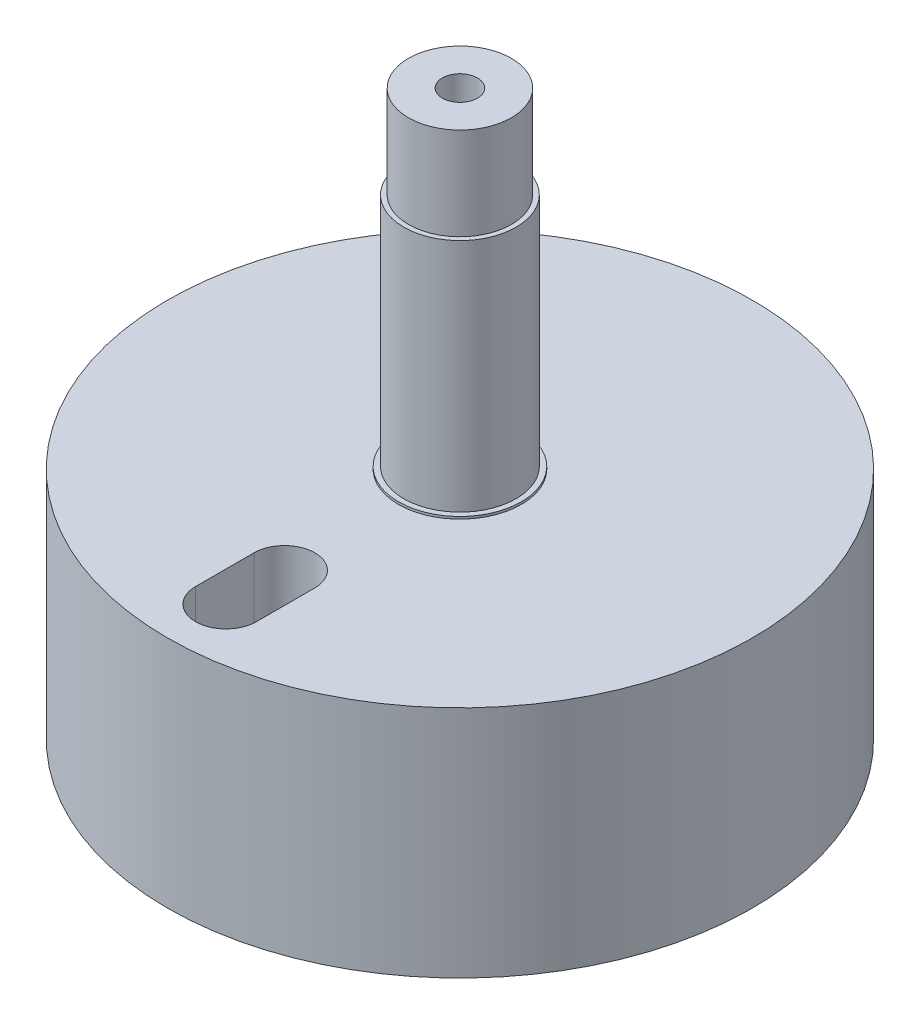
ISO-10303-21;
HEADER;
FILE_DESCRIPTION(('STEP AP214'),'2;1');
FILE_NAME('part.step','',(''),(''),'','','');
FILE_SCHEMA(('AUTOMOTIVE_DESIGN { 1 0 10303 214 1 1 1 1 }'));
ENDSEC;
DATA;
#1=APPLICATION_CONTEXT('core data for automotive mechanical design processes');
#2=APPLICATION_PROTOCOL_DEFINITION('international standard','automotive_design',2000,#1);
#3=PRODUCT_CONTEXT('',#1,'mechanical');
#4=PRODUCT('Part','Part','',(#3));
#5=PRODUCT_RELATED_PRODUCT_CATEGORY('part','',(#4));
#6=PRODUCT_DEFINITION_FORMATION('','',#4);
#7=PRODUCT_DEFINITION_CONTEXT('part definition',#1,'design');
#8=PRODUCT_DEFINITION('design','',#6,#7);
#9=PRODUCT_DEFINITION_SHAPE('','',#8);
#10=(LENGTH_UNIT() NAMED_UNIT(*) SI_UNIT(.MILLI.,.METRE.));
#11=(NAMED_UNIT(*) PLANE_ANGLE_UNIT() SI_UNIT($,.RADIAN.));
#12=(NAMED_UNIT(*) SI_UNIT($,.STERADIAN.) SOLID_ANGLE_UNIT());
#13=UNCERTAINTY_MEASURE_WITH_UNIT(LENGTH_MEASURE(1.E-05),#10,'distance_accuracy_value','');
#14=(GEOMETRIC_REPRESENTATION_CONTEXT(3) GLOBAL_UNCERTAINTY_ASSIGNED_CONTEXT((#13)) GLOBAL_UNIT_ASSIGNED_CONTEXT((#10,
#11,#12)) REPRESENTATION_CONTEXT('',''));
#15=CARTESIAN_POINT('',(0.,0.,0.));
#16=DIRECTION('',(0.,0.,1.));
#17=DIRECTION('',(1.,0.,0.));
#18=AXIS2_PLACEMENT_3D('',#15,#16,#17);
#19=CARTESIAN_POINT('',(0.,20.,0.));
#20=DIRECTION('',(0.,-1.,0.));
#21=DIRECTION('',(0.,0.,-1.));
#22=AXIS2_PLACEMENT_3D('',#19,#20,#21);
#23=CYLINDRICAL_SURFACE('',#22,25.);
#24=CARTESIAN_POINT('',(0.,20.,0.));
#25=DIRECTION('',(0.,1.,0.));
#26=DIRECTION('',(0.,0.,1.));
#27=AXIS2_PLACEMENT_3D('',#24,#25,#26);
#28=CIRCLE('',#27,25.);
#29=CARTESIAN_POINT('',(0.,20.,25.));
#30=VERTEX_POINT('',#29);
#31=EDGE_CURVE('E119',#30,#30,#28,.T.);
#32=ORIENTED_EDGE('',*,*,#31,.F.);
#33=EDGE_LOOP('',(#32));
#34=FACE_BOUND('',#33,.T.);
#35=CARTESIAN_POINT('',(0.,0.,0.));
#36=DIRECTION('',(0.,1.,0.));
#37=DIRECTION('',(0.,0.,1.));
#38=AXIS2_PLACEMENT_3D('',#35,#36,#37);
#39=CIRCLE('',#38,25.);
#40=CARTESIAN_POINT('',(0.,0.,25.));
#41=VERTEX_POINT('',#40);
#42=EDGE_CURVE('E42',#41,#41,#39,.T.);
#43=ORIENTED_EDGE('',*,*,#42,.T.);
#44=EDGE_LOOP('',(#43));
#45=FACE_BOUND('',#44,.T.);
#46=ADVANCED_FACE('F39',(#34,#45),#23,.T.);
#47=CARTESIAN_POINT('',(0.,20.,0.));
#48=DIRECTION('',(0.,1.,0.));
#49=DIRECTION('',(0.,0.,1.));
#50=AXIS2_PLACEMENT_3D('',#47,#48,#49);
#51=PLANE('',#50);
#52=CARTESIAN_POINT('',(0.,20.,0.));
#53=DIRECTION('',(0.,1.,0.));
#54=DIRECTION('',(0.,0.,1.));
#55=AXIS2_PLACEMENT_3D('',#52,#53,#54);
#56=CIRCLE('',#55,5.25);
#57=CARTESIAN_POINT('',(0.,20.,5.25));
#58=VERTEX_POINT('',#57);
#59=EDGE_CURVE('E279',#58,#58,#56,.T.);
#60=ORIENTED_EDGE('',*,*,#59,.F.);
#61=EDGE_LOOP('',(#60));
#62=FACE_BOUND('',#61,.T.);
#63=CARTESIAN_POINT('',(0.,20.,15.));
#64=DIRECTION('',(0.,1.,0.));
#65=DIRECTION('',(0.,0.,1.));
#66=AXIS2_PLACEMENT_3D('',#63,#64,#65);
#67=CIRCLE('',#66,2.6);
#68=CARTESIAN_POINT('',(2.6,20.,15.));
#69=VERTEX_POINT('',#68);
#70=CARTESIAN_POINT('',(-2.6,20.,15.));
#71=VERTEX_POINT('',#70);
#72=EDGE_CURVE('E55',#69,#71,#67,.T.);
#73=ORIENTED_EDGE('',*,*,#72,.F.);
#74=DIRECTION('',(0.,0.,-1.));
#75=VECTOR('',#74,1.);
#76=CARTESIAN_POINT('',(2.6,20.,15.));
#77=LINE('',#76,#75);
#78=CARTESIAN_POINT('',(2.6,20.,20.));
#79=VERTEX_POINT('',#78);
#80=EDGE_CURVE('E106',#79,#69,#77,.T.);
#81=ORIENTED_EDGE('',*,*,#80,.F.);
#82=CARTESIAN_POINT('',(0.,20.,20.));
#83=DIRECTION('',(0.,1.,0.));
#84=DIRECTION('',(0.,0.,1.));
#85=AXIS2_PLACEMENT_3D('',#82,#83,#84);
#86=CIRCLE('',#85,2.6);
#87=CARTESIAN_POINT('',(-2.6,20.,20.));
#88=VERTEX_POINT('',#87);
#89=EDGE_CURVE('E114',#88,#79,#86,.T.);
#90=ORIENTED_EDGE('',*,*,#89,.F.);
#91=DIRECTION('',(0.,0.,1.));
#92=VECTOR('',#91,1.);
#93=CARTESIAN_POINT('',(-2.6,20.,15.));
#94=LINE('',#93,#92);
#95=EDGE_CURVE('E90',#71,#88,#94,.T.);
#96=ORIENTED_EDGE('',*,*,#95,.F.);
#97=EDGE_LOOP('',(#73,#81,#90,#96));
#98=FACE_BOUND('',#97,.T.);
#99=ORIENTED_EDGE('',*,*,#31,.T.);
#100=EDGE_LOOP('',(#99));
#101=FACE_BOUND('',#100,.T.);
#102=ADVANCED_FACE('F132',(#62,#98,#101),#51,.T.);
#103=CARTESIAN_POINT('',(0.,0.,0.));
#104=DIRECTION('',(0.,1.,0.));
#105=DIRECTION('',(0.,0.,1.));
#106=AXIS2_PLACEMENT_3D('',#103,#104,#105);
#107=PLANE('',#106);
#108=CARTESIAN_POINT('',(0.,0.,0.));
#109=DIRECTION('',(0.,-1.,0.));
#110=DIRECTION('',(0.,0.,-1.));
#111=AXIS2_PLACEMENT_3D('',#108,#109,#110);
#112=CIRCLE('',#111,1.5);
#113=CARTESIAN_POINT('',(0.,0.,-1.5));
#114=VERTEX_POINT('',#113);
#115=EDGE_CURVE('E270',#114,#114,#112,.T.);
#116=ORIENTED_EDGE('',*,*,#115,.F.);
#117=EDGE_LOOP('',(#116));
#118=FACE_BOUND('',#117,.T.);
#119=CARTESIAN_POINT('',(0.,0.,17.5));
#120=DIRECTION('',(0.,1.,0.));
#121=DIRECTION('',(0.,0.,1.));
#122=AXIS2_PLACEMENT_3D('',#119,#120,#121);
#123=CIRCLE('',#122,1.5);
#124=CARTESIAN_POINT('',(0.,0.,19.));
#125=VERTEX_POINT('',#124);
#126=EDGE_CURVE('E112',#125,#125,#123,.T.);
#127=ORIENTED_EDGE('',*,*,#126,.T.);
#128=EDGE_LOOP('',(#127));
#129=FACE_BOUND('',#128,.T.);
#130=ORIENTED_EDGE('',*,*,#42,.F.);
#131=EDGE_LOOP('',(#130));
#132=FACE_BOUND('',#131,.T.);
#133=ADVANCED_FACE('F129',(#118,#129,#132),#107,.F.);
#134=CARTESIAN_POINT('',(0.,10.,15.));
#135=DIRECTION('',(0.,1.,0.));
#136=DIRECTION('',(0.,0.,1.));
#137=AXIS2_PLACEMENT_3D('',#134,#135,#136);
#138=CYLINDRICAL_SURFACE('',#137,2.6);
#139=ORIENTED_EDGE('',*,*,#72,.T.);
#140=DIRECTION('',(0.,1.,0.));
#141=VECTOR('',#140,1.);
#142=CARTESIAN_POINT('',(-2.6,10.,15.));
#143=LINE('',#142,#141);
#144=CARTESIAN_POINT('',(-2.6,10.,15.));
#145=VERTEX_POINT('',#144);
#146=EDGE_CURVE('E78',#145,#71,#143,.T.);
#147=ORIENTED_EDGE('',*,*,#146,.F.);
#148=CARTESIAN_POINT('',(0.,10.,15.));
#149=DIRECTION('',(0.,1.,0.));
#150=DIRECTION('',(0.,0.,1.));
#151=AXIS2_PLACEMENT_3D('',#148,#149,#150);
#152=CIRCLE('',#151,2.6);
#153=CARTESIAN_POINT('',(2.6,10.,15.));
#154=VERTEX_POINT('',#153);
#155=EDGE_CURVE('E104',#154,#145,#152,.T.);
#156=ORIENTED_EDGE('',*,*,#155,.F.);
#157=DIRECTION('',(0.,1.,0.));
#158=VECTOR('',#157,1.);
#159=CARTESIAN_POINT('',(2.6,10.,15.));
#160=LINE('',#159,#158);
#161=EDGE_CURVE('E63',#154,#69,#160,.T.);
#162=ORIENTED_EDGE('',*,*,#161,.T.);
#163=EDGE_LOOP('',(#139,#147,#156,#162));
#164=FACE_BOUND('',#163,.T.);
#165=ADVANCED_FACE('F131',(#164),#138,.F.);
#166=CARTESIAN_POINT('',(2.6,10.,15.));
#167=DIRECTION('',(1.,0.,0.));
#168=DIRECTION('',(0.,0.,-1.));
#169=AXIS2_PLACEMENT_3D('',#166,#167,#168);
#170=PLANE('',#169);
#171=ORIENTED_EDGE('',*,*,#80,.T.);
#172=ORIENTED_EDGE('',*,*,#161,.F.);
#173=DIRECTION('',(0.,0.,-1.));
#174=VECTOR('',#173,1.);
#175=CARTESIAN_POINT('',(2.6,10.,15.));
#176=LINE('',#175,#174);
#177=CARTESIAN_POINT('',(2.6,10.,20.));
#178=VERTEX_POINT('',#177);
#179=EDGE_CURVE('E101',#178,#154,#176,.T.);
#180=ORIENTED_EDGE('',*,*,#179,.F.);
#181=DIRECTION('',(0.,1.,0.));
#182=VECTOR('',#181,1.);
#183=CARTESIAN_POINT('',(2.6,10.,20.));
#184=LINE('',#183,#182);
#185=EDGE_CURVE('E94',#178,#79,#184,.T.);
#186=ORIENTED_EDGE('',*,*,#185,.T.);
#187=EDGE_LOOP('',(#171,#172,#180,#186));
#188=FACE_BOUND('',#187,.T.);
#189=ADVANCED_FACE('F139',(#188),#170,.F.);
#190=CARTESIAN_POINT('',(0.,10.,20.));
#191=DIRECTION('',(0.,1.,0.));
#192=DIRECTION('',(0.,0.,1.));
#193=AXIS2_PLACEMENT_3D('',#190,#191,#192);
#194=CYLINDRICAL_SURFACE('',#193,2.6);
#195=ORIENTED_EDGE('',*,*,#89,.T.);
#196=ORIENTED_EDGE('',*,*,#185,.F.);
#197=CARTESIAN_POINT('',(0.,10.,20.));
#198=DIRECTION('',(0.,1.,0.));
#199=DIRECTION('',(0.,0.,1.));
#200=AXIS2_PLACEMENT_3D('',#197,#198,#199);
#201=CIRCLE('',#200,2.6);
#202=CARTESIAN_POINT('',(-2.6,10.,20.));
#203=VERTEX_POINT('',#202);
#204=EDGE_CURVE('E97',#203,#178,#201,.T.);
#205=ORIENTED_EDGE('',*,*,#204,.F.);
#206=DIRECTION('',(0.,1.,0.));
#207=VECTOR('',#206,1.);
#208=CARTESIAN_POINT('',(-2.6,10.,20.));
#209=LINE('',#208,#207);
#210=EDGE_CURVE('E83',#203,#88,#209,.T.);
#211=ORIENTED_EDGE('',*,*,#210,.T.);
#212=EDGE_LOOP('',(#195,#196,#205,#211));
#213=FACE_BOUND('',#212,.T.);
#214=ADVANCED_FACE('F98',(#213),#194,.F.);
#215=CARTESIAN_POINT('',(-2.6,10.,15.));
#216=DIRECTION('',(-1.,0.,0.));
#217=DIRECTION('',(0.,0.,1.));
#218=AXIS2_PLACEMENT_3D('',#215,#216,#217);
#219=PLANE('',#218);
#220=ORIENTED_EDGE('',*,*,#95,.T.);
#221=ORIENTED_EDGE('',*,*,#210,.F.);
#222=DIRECTION('',(0.,0.,1.));
#223=VECTOR('',#222,1.);
#224=CARTESIAN_POINT('',(-2.6,10.,15.));
#225=LINE('',#224,#223);
#226=EDGE_CURVE('E87',#145,#203,#225,.T.);
#227=ORIENTED_EDGE('',*,*,#226,.F.);
#228=ORIENTED_EDGE('',*,*,#146,.T.);
#229=EDGE_LOOP('',(#220,#221,#227,#228));
#230=FACE_BOUND('',#229,.T.);
#231=ADVANCED_FACE('F85',(#230),#219,.F.);
#232=CARTESIAN_POINT('',(0.,10.,15.));
#233=DIRECTION('',(0.,1.,0.));
#234=DIRECTION('',(0.,0.,1.));
#235=AXIS2_PLACEMENT_3D('',#232,#233,#234);
#236=PLANE('',#235);
#237=CARTESIAN_POINT('',(0.,10.,17.5));
#238=DIRECTION('',(0.,1.,0.));
#239=DIRECTION('',(0.,0.,1.));
#240=AXIS2_PLACEMENT_3D('',#237,#238,#239);
#241=CIRCLE('',#240,1.5);
#242=CARTESIAN_POINT('',(0.,10.,19.));
#243=VERTEX_POINT('',#242);
#244=EDGE_CURVE('E284',#243,#243,#241,.T.);
#245=ORIENTED_EDGE('',*,*,#244,.F.);
#246=EDGE_LOOP('',(#245));
#247=FACE_BOUND('',#246,.T.);
#248=ORIENTED_EDGE('',*,*,#155,.T.);
#249=ORIENTED_EDGE('',*,*,#226,.T.);
#250=ORIENTED_EDGE('',*,*,#204,.T.);
#251=ORIENTED_EDGE('',*,*,#179,.T.);
#252=EDGE_LOOP('',(#248,#249,#250,#251));
#253=FACE_BOUND('',#252,.T.);
#254=ADVANCED_FACE('F103',(#247,#253),#236,.T.);
#255=CARTESIAN_POINT('',(0.,0.,17.5));
#256=DIRECTION('',(0.,1.,0.));
#257=DIRECTION('',(0.,0.,1.));
#258=AXIS2_PLACEMENT_3D('',#255,#256,#257);
#259=CYLINDRICAL_SURFACE('',#258,1.5);
#260=ORIENTED_EDGE('',*,*,#126,.F.);
#261=EDGE_LOOP('',(#260));
#262=FACE_BOUND('',#261,.T.);
#263=ORIENTED_EDGE('',*,*,#244,.T.);
#264=EDGE_LOOP('',(#263));
#265=FACE_BOUND('',#264,.T.);
#266=ADVANCED_FACE('F184',(#262,#265),#259,.F.);
#267=CARTESIAN_POINT('',(0.,20.2,0.));
#268=DIRECTION('',(0.,-1.,0.));
#269=DIRECTION('',(0.,0.,-1.));
#270=AXIS2_PLACEMENT_3D('',#267,#268,#269);
#271=CYLINDRICAL_SURFACE('',#270,5.25);
#272=CARTESIAN_POINT('',(0.,20.2,0.));
#273=DIRECTION('',(0.,1.,0.));
#274=DIRECTION('',(0.,0.,1.));
#275=AXIS2_PLACEMENT_3D('',#272,#273,#274);
#276=CIRCLE('',#275,5.25);
#277=CARTESIAN_POINT('',(0.,20.2,5.25));
#278=VERTEX_POINT('',#277);
#279=EDGE_CURVE('E281',#278,#278,#276,.T.);
#280=ORIENTED_EDGE('',*,*,#279,.F.);
#281=EDGE_LOOP('',(#280));
#282=FACE_BOUND('',#281,.T.);
#283=ORIENTED_EDGE('',*,*,#59,.T.);
#284=EDGE_LOOP('',(#283));
#285=FACE_BOUND('',#284,.T.);
#286=ADVANCED_FACE('F192',(#282,#285),#271,.T.);
#287=CARTESIAN_POINT('',(0.,20.2,0.));
#288=DIRECTION('',(0.,1.,0.));
#289=DIRECTION('',(0.,0.,1.));
#290=AXIS2_PLACEMENT_3D('',#287,#288,#289);
#291=PLANE('',#290);
#292=CARTESIAN_POINT('',(0.,20.2,0.));
#293=DIRECTION('',(0.,1.,0.));
#294=DIRECTION('',(0.,0.,1.));
#295=AXIS2_PLACEMENT_3D('',#292,#293,#294);
#296=CIRCLE('',#295,4.8);
#297=CARTESIAN_POINT('',(0.,20.2,4.8));
#298=VERTEX_POINT('',#297);
#299=EDGE_CURVE('E47',#298,#298,#296,.T.);
#300=ORIENTED_EDGE('',*,*,#299,.F.);
#301=EDGE_LOOP('',(#300));
#302=FACE_BOUND('',#301,.T.);
#303=ORIENTED_EDGE('',*,*,#279,.T.);
#304=EDGE_LOOP('',(#303));
#305=FACE_BOUND('',#304,.T.);
#306=ADVANCED_FACE('F206',(#302,#305),#291,.T.);
#307=CARTESIAN_POINT('',(0.,40.3,0.));
#308=DIRECTION('',(0.,-1.,0.));
#309=DIRECTION('',(0.,0.,-1.));
#310=AXIS2_PLACEMENT_3D('',#307,#308,#309);
#311=CYLINDRICAL_SURFACE('',#310,4.8);
#312=CARTESIAN_POINT('',(0.,40.3,0.));
#313=DIRECTION('',(0.,1.,0.));
#314=DIRECTION('',(0.,0.,1.));
#315=AXIS2_PLACEMENT_3D('',#312,#313,#314);
#316=CIRCLE('',#315,4.8);
#317=CARTESIAN_POINT('',(0.,40.3,4.8));
#318=VERTEX_POINT('',#317);
#319=EDGE_CURVE('E276',#318,#318,#316,.T.);
#320=ORIENTED_EDGE('',*,*,#319,.F.);
#321=EDGE_LOOP('',(#320));
#322=FACE_BOUND('',#321,.T.);
#323=ORIENTED_EDGE('',*,*,#299,.T.);
#324=EDGE_LOOP('',(#323));
#325=FACE_BOUND('',#324,.T.);
#326=ADVANCED_FACE('F215',(#322,#325),#311,.T.);
#327=CARTESIAN_POINT('',(0.,40.3,0.));
#328=DIRECTION('',(0.,1.,0.));
#329=DIRECTION('',(0.,0.,1.));
#330=AXIS2_PLACEMENT_3D('',#327,#328,#329);
#331=PLANE('',#330);
#332=CARTESIAN_POINT('',(0.,40.3,0.));
#333=DIRECTION('',(0.,1.,0.));
#334=DIRECTION('',(0.,0.,1.));
#335=AXIS2_PLACEMENT_3D('',#332,#333,#334);
#336=CIRCLE('',#335,4.4);
#337=CARTESIAN_POINT('',(0.,40.3,4.4));
#338=VERTEX_POINT('',#337);
#339=EDGE_CURVE('E11',#338,#338,#336,.T.);
#340=ORIENTED_EDGE('',*,*,#339,.F.);
#341=EDGE_LOOP('',(#340));
#342=FACE_BOUND('',#341,.T.);
#343=ORIENTED_EDGE('',*,*,#319,.T.);
#344=EDGE_LOOP('',(#343));
#345=FACE_BOUND('',#344,.T.);
#346=ADVANCED_FACE('F224',(#342,#345),#331,.T.);
#347=CARTESIAN_POINT('',(0.,48.2,0.));
#348=DIRECTION('',(0.,-1.,0.));
#349=DIRECTION('',(0.,0.,-1.));
#350=AXIS2_PLACEMENT_3D('',#347,#348,#349);
#351=CYLINDRICAL_SURFACE('',#350,4.4);
#352=CARTESIAN_POINT('',(0.,48.2,0.));
#353=DIRECTION('',(0.,1.,0.));
#354=DIRECTION('',(0.,0.,1.));
#355=AXIS2_PLACEMENT_3D('',#352,#353,#354);
#356=CIRCLE('',#355,4.4);
#357=CARTESIAN_POINT('',(0.,48.2,4.4));
#358=VERTEX_POINT('',#357);
#359=EDGE_CURVE('E272',#358,#358,#356,.T.);
#360=ORIENTED_EDGE('',*,*,#359,.F.);
#361=EDGE_LOOP('',(#360));
#362=FACE_BOUND('',#361,.T.);
#363=ORIENTED_EDGE('',*,*,#339,.T.);
#364=EDGE_LOOP('',(#363));
#365=FACE_BOUND('',#364,.T.);
#366=ADVANCED_FACE('F232',(#362,#365),#351,.T.);
#367=CARTESIAN_POINT('',(0.,48.2,0.));
#368=DIRECTION('',(0.,1.,0.));
#369=DIRECTION('',(0.,0.,1.));
#370=AXIS2_PLACEMENT_3D('',#367,#368,#369);
#371=PLANE('',#370);
#372=CARTESIAN_POINT('',(0.,48.2,0.));
#373=DIRECTION('',(0.,-1.,0.));
#374=DIRECTION('',(0.,0.,-1.));
#375=AXIS2_PLACEMENT_3D('',#372,#373,#374);
#376=CIRCLE('',#375,1.5);
#377=CARTESIAN_POINT('',(0.,48.2,-1.5));
#378=VERTEX_POINT('',#377);
#379=EDGE_CURVE('E268',#378,#378,#376,.T.);
#380=ORIENTED_EDGE('',*,*,#379,.T.);
#381=EDGE_LOOP('',(#380));
#382=FACE_BOUND('',#381,.T.);
#383=ORIENTED_EDGE('',*,*,#359,.T.);
#384=EDGE_LOOP('',(#383));
#385=FACE_BOUND('',#384,.T.);
#386=ADVANCED_FACE('F240',(#382,#385),#371,.T.);
#387=CARTESIAN_POINT('',(0.,48.2,0.));
#388=DIRECTION('',(0.,-1.,0.));
#389=DIRECTION('',(0.,0.,-1.));
#390=AXIS2_PLACEMENT_3D('',#387,#388,#389);
#391=CYLINDRICAL_SURFACE('',#390,1.5);
#392=ORIENTED_EDGE('',*,*,#379,.F.);
#393=EDGE_LOOP('',(#392));
#394=FACE_BOUND('',#393,.T.);
#395=ORIENTED_EDGE('',*,*,#115,.T.);
#396=EDGE_LOOP('',(#395));
#397=FACE_BOUND('',#396,.T.);
#398=ADVANCED_FACE('F252',(#394,#397),#391,.F.);
#399=CLOSED_SHELL('',(#46,#102,#133,#165,#189,#214,#231,#254,#266,#286,#306,#326,#346,#366,#386,#398));
#400=MANIFOLD_SOLID_BREP('B2',#399);
#401=ADVANCED_BREP_SHAPE_REPRESENTATION('',(#18,#400),#14);
#402=SHAPE_DEFINITION_REPRESENTATION(#9,#401);
ENDSEC;
END-ISO-10303-21;
